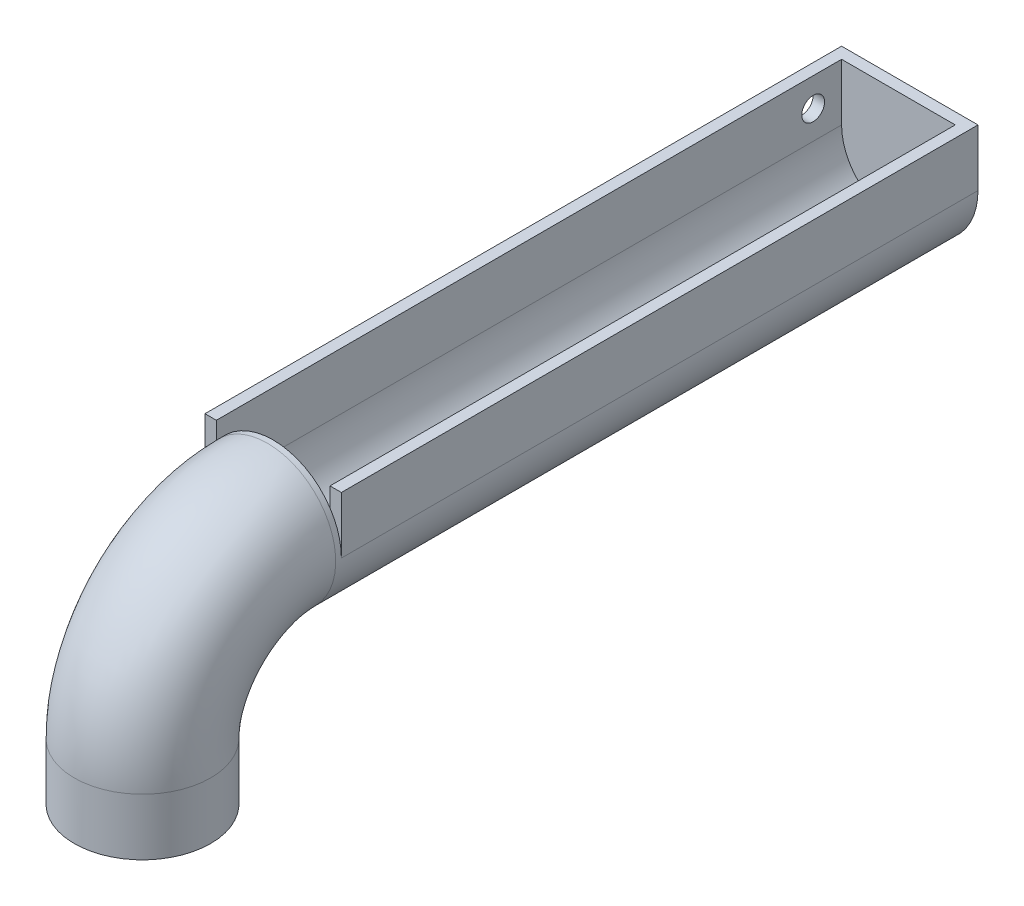
ISO-10303-21;
HEADER;
FILE_DESCRIPTION(('STEP AP214'),'2;1');
FILE_NAME('part.step','',(''),(''),'','','');
FILE_SCHEMA(('AUTOMOTIVE_DESIGN { 1 0 10303 214 1 1 1 1 }'));
ENDSEC;
DATA;
#1=APPLICATION_CONTEXT('core data for automotive mechanical design processes');
#2=APPLICATION_PROTOCOL_DEFINITION('international standard','automotive_design',2000,#1);
#3=PRODUCT_CONTEXT('',#1,'mechanical');
#4=PRODUCT('Part','Part','',(#3));
#5=PRODUCT_RELATED_PRODUCT_CATEGORY('part','',(#4));
#6=PRODUCT_DEFINITION_FORMATION('','',#4);
#7=PRODUCT_DEFINITION_CONTEXT('part definition',#1,'design');
#8=PRODUCT_DEFINITION('design','',#6,#7);
#9=PRODUCT_DEFINITION_SHAPE('','',#8);
#10=(LENGTH_UNIT() NAMED_UNIT(*) SI_UNIT(.MILLI.,.METRE.));
#11=(NAMED_UNIT(*) PLANE_ANGLE_UNIT() SI_UNIT($,.RADIAN.));
#12=(NAMED_UNIT(*) SI_UNIT($,.STERADIAN.) SOLID_ANGLE_UNIT());
#13=UNCERTAINTY_MEASURE_WITH_UNIT(LENGTH_MEASURE(1.E-05),#10,'distance_accuracy_value','');
#14=(GEOMETRIC_REPRESENTATION_CONTEXT(3) GLOBAL_UNCERTAINTY_ASSIGNED_CONTEXT((#13)) GLOBAL_UNIT_ASSIGNED_CONTEXT((#10,
#11,#12)) REPRESENTATION_CONTEXT('',''));
#15=CARTESIAN_POINT('',(0.,0.,0.));
#16=DIRECTION('',(0.,0.,1.));
#17=DIRECTION('',(1.,0.,0.));
#18=AXIS2_PLACEMENT_3D('',#15,#16,#17);
#19=CARTESIAN_POINT('',(0.,0.,110.));
#20=DIRECTION('',(0.,0.,1.));
#21=DIRECTION('',(1.,0.,0.));
#22=AXIS2_PLACEMENT_3D('',#19,#20,#21);
#23=PLANE('',#22);
#24=CARTESIAN_POINT('',(0.,0.,110.));
#25=DIRECTION('',(0.,0.,1.));
#26=DIRECTION('',(1.,0.,0.));
#27=AXIS2_PLACEMENT_3D('',#24,#25,#26);
#28=CIRCLE('',#27,12.);
#29=CARTESIAN_POINT('',(12.,0.,110.));
#30=VERTEX_POINT('',#29);
#31=CARTESIAN_POINT('',(10.,6.6332495807108,110.));
#32=VERTEX_POINT('',#31);
#33=EDGE_CURVE('E52',#30,#32,#28,.T.);
#34=ORIENTED_EDGE('',*,*,#33,.F.);
#35=DIRECTION('',(0.,1.,0.));
#36=VECTOR('',#35,1.);
#37=CARTESIAN_POINT('',(12.,10.,110.));
#38=LINE('',#37,#36);
#39=CARTESIAN_POINT('',(12.,10.,110.));
#40=VERTEX_POINT('',#39);
#41=EDGE_CURVE('E113',#30,#40,#38,.T.);
#42=ORIENTED_EDGE('',*,*,#41,.T.);
#43=DIRECTION('',(-1.,0.,0.));
#44=VECTOR('',#43,1.);
#45=CARTESIAN_POINT('',(10.,10.,110.));
#46=LINE('',#45,#44);
#47=CARTESIAN_POINT('',(10.,10.,110.));
#48=VERTEX_POINT('',#47);
#49=EDGE_CURVE('E183',#40,#48,#46,.T.);
#50=ORIENTED_EDGE('',*,*,#49,.T.);
#51=DIRECTION('',(0.,-1.,0.));
#52=VECTOR('',#51,1.);
#53=CARTESIAN_POINT('',(10.,10.,110.));
#54=LINE('',#53,#52);
#55=EDGE_CURVE('E138',#48,#32,#54,.T.);
#56=ORIENTED_EDGE('',*,*,#55,.T.);
#57=EDGE_LOOP('',(#34,#42,#50,#56));
#58=FACE_BOUND('',#57,.T.);
#59=ADVANCED_FACE('F41',(#58),#23,.T.);
#60=CARTESIAN_POINT('',(10.,10.,110.));
#61=DIRECTION('',(1.,0.,0.));
#62=DIRECTION('',(0.,0.,-1.));
#63=AXIS2_PLACEMENT_3D('',#60,#61,#62);
#64=PLANE('',#63);
#65=DIRECTION('',(0.,-1.,0.));
#66=VECTOR('',#65,1.);
#67=CARTESIAN_POINT('',(10.,10.,0.));
#68=LINE('',#67,#66);
#69=CARTESIAN_POINT('',(10.,10.,0.));
#70=VERTEX_POINT('',#69);
#71=CARTESIAN_POINT('',(10.,0.,0.));
#72=VERTEX_POINT('',#71);
#73=EDGE_CURVE('E180',#70,#72,#68,.T.);
#74=ORIENTED_EDGE('',*,*,#73,.T.);
#75=DIRECTION('',(0.,0.,-1.));
#76=VECTOR('',#75,1.);
#77=CARTESIAN_POINT('',(10.,0.,110.));
#78=LINE('',#77,#76);
#79=CARTESIAN_POINT('',(10.,0.,110.));
#80=VERTEX_POINT('',#79);
#81=EDGE_CURVE('E223',#80,#72,#78,.T.);
#82=ORIENTED_EDGE('',*,*,#81,.F.);
#83=EDGE_CURVE('E66',#32,#80,#54,.T.);
#84=ORIENTED_EDGE('',*,*,#83,.F.);
#85=ORIENTED_EDGE('',*,*,#55,.F.);
#86=DIRECTION('',(0.,0.,-1.));
#87=VECTOR('',#86,1.);
#88=CARTESIAN_POINT('',(10.,10.,110.));
#89=LINE('',#88,#87);
#90=EDGE_CURVE('E45',#48,#70,#89,.T.);
#91=ORIENTED_EDGE('',*,*,#90,.T.);
#92=EDGE_LOOP('',(#74,#82,#84,#85,#91));
#93=FACE_BOUND('',#92,.T.);
#94=ADVANCED_FACE('F43',(#93),#64,.F.);
#95=CARTESIAN_POINT('',(0.,0.,110.));
#96=DIRECTION('',(0.,0.,-1.));
#97=DIRECTION('',(-1.,0.,0.));
#98=AXIS2_PLACEMENT_3D('',#95,#96,#97);
#99=CYLINDRICAL_SURFACE('',#98,10.);
#100=CARTESIAN_POINT('',(0.,0.,0.));
#101=DIRECTION('',(0.,0.,-1.));
#102=DIRECTION('',(1.,0.,0.));
#103=AXIS2_PLACEMENT_3D('',#100,#101,#102);
#104=CIRCLE('',#103,10.);
#105=CARTESIAN_POINT('',(-10.,0.,0.));
#106=VERTEX_POINT('',#105);
#107=EDGE_CURVE('E202',#72,#106,#104,.T.);
#108=ORIENTED_EDGE('',*,*,#107,.T.);
#109=DIRECTION('',(0.,0.,-1.));
#110=VECTOR('',#109,1.);
#111=CARTESIAN_POINT('',(-10.,0.,110.));
#112=LINE('',#111,#110);
#113=CARTESIAN_POINT('',(-10.,0.,110.));
#114=VERTEX_POINT('',#113);
#115=EDGE_CURVE('E220',#114,#106,#112,.T.);
#116=ORIENTED_EDGE('',*,*,#115,.F.);
#117=CARTESIAN_POINT('',(0.,0.,110.));
#118=DIRECTION('',(0.,0.,1.));
#119=DIRECTION('',(1.,0.,0.));
#120=AXIS2_PLACEMENT_3D('',#117,#118,#119);
#121=CIRCLE('',#120,10.);
#122=EDGE_CURVE('E145',#114,#80,#121,.F.);
#123=ORIENTED_EDGE('',*,*,#122,.T.);
#124=ORIENTED_EDGE('',*,*,#81,.T.);
#125=EDGE_LOOP('',(#108,#116,#123,#124));
#126=FACE_BOUND('',#125,.T.);
#127=CARTESIAN_POINT('',(0.,0.,111.));
#128=DIRECTION('',(0.,0.,1.));
#129=DIRECTION('',(1.,0.,0.));
#130=AXIS2_PLACEMENT_3D('',#127,#128,#129);
#131=CIRCLE('',#130,10.);
#132=CARTESIAN_POINT('',(0.,9.99999999999999,111.));
#133=VERTEX_POINT('',#132);
#134=EDGE_CURVE('E246',#133,#133,#131,.F.);
#135=ORIENTED_EDGE('',*,*,#134,.F.);
#136=EDGE_LOOP('',(#135));
#137=FACE_BOUND('',#136,.T.);
#138=ADVANCED_FACE('F242',(#126,#137),#99,.F.);
#139=CARTESIAN_POINT('',(-10.,0.,110.));
#140=DIRECTION('',(-1.,0.,0.));
#141=DIRECTION('',(0.,0.,1.));
#142=AXIS2_PLACEMENT_3D('',#139,#140,#141);
#143=PLANE('',#142);
#144=CARTESIAN_POINT('',(-10.,5.,5.));
#145=DIRECTION('',(-1.,0.,0.));
#146=DIRECTION('',(0.,0.,1.));
#147=AXIS2_PLACEMENT_3D('',#144,#145,#146);
#148=CIRCLE('',#147,2.005);
#149=CARTESIAN_POINT('',(-10.,5.,7.005));
#150=VERTEX_POINT('',#149);
#151=EDGE_CURVE('E157',#150,#150,#148,.T.);
#152=ORIENTED_EDGE('',*,*,#151,.T.);
#153=EDGE_LOOP('',(#152));
#154=FACE_BOUND('',#153,.T.);
#155=DIRECTION('',(0.,1.,0.));
#156=VECTOR('',#155,1.);
#157=CARTESIAN_POINT('',(-10.,0.,0.));
#158=LINE('',#157,#156);
#159=CARTESIAN_POINT('',(-10.,10.,0.));
#160=VERTEX_POINT('',#159);
#161=EDGE_CURVE('E186',#106,#160,#158,.T.);
#162=ORIENTED_EDGE('',*,*,#161,.T.);
#163=DIRECTION('',(0.,0.,-1.));
#164=VECTOR('',#163,1.);
#165=CARTESIAN_POINT('',(-10.,10.,110.));
#166=LINE('',#165,#164);
#167=CARTESIAN_POINT('',(-10.,10.,110.));
#168=VERTEX_POINT('',#167);
#169=EDGE_CURVE('E216',#168,#160,#166,.T.);
#170=ORIENTED_EDGE('',*,*,#169,.F.);
#171=DIRECTION('',(0.,1.,0.));
#172=VECTOR('',#171,1.);
#173=CARTESIAN_POINT('',(-10.,0.,110.));
#174=LINE('',#173,#172);
#175=CARTESIAN_POINT('',(-10.,6.6332495807108,110.));
#176=VERTEX_POINT('',#175);
#177=EDGE_CURVE('E189',#176,#168,#174,.T.);
#178=ORIENTED_EDGE('',*,*,#177,.F.);
#179=EDGE_CURVE('E190',#114,#176,#174,.T.);
#180=ORIENTED_EDGE('',*,*,#179,.F.);
#181=ORIENTED_EDGE('',*,*,#115,.T.);
#182=EDGE_LOOP('',(#162,#170,#178,#180,#181));
#183=FACE_BOUND('',#182,.T.);
#184=ADVANCED_FACE('F239',(#154,#183),#143,.F.);
#185=CARTESIAN_POINT('',(-12.,10.,110.));
#186=DIRECTION('',(0.,-1.,0.));
#187=DIRECTION('',(0.,0.,-1.));
#188=AXIS2_PLACEMENT_3D('',#185,#186,#187);
#189=PLANE('',#188);
#190=ORIENTED_EDGE('',*,*,#169,.T.);
#191=DIRECTION('',(-1.,0.,0.));
#192=VECTOR('',#191,1.);
#193=CARTESIAN_POINT('',(0.,10.,0.));
#194=LINE('',#193,#192);
#195=EDGE_CURVE('E161',#70,#160,#194,.T.);
#196=ORIENTED_EDGE('',*,*,#195,.F.);
#197=ORIENTED_EDGE('',*,*,#90,.F.);
#198=ORIENTED_EDGE('',*,*,#49,.F.);
#199=DIRECTION('',(0.,0.,-1.));
#200=VECTOR('',#199,1.);
#201=CARTESIAN_POINT('',(12.,10.,110.));
#202=LINE('',#201,#200);
#203=CARTESIAN_POINT('',(12.,10.,-2.));
#204=VERTEX_POINT('',#203);
#205=EDGE_CURVE('E119',#40,#204,#202,.T.);
#206=ORIENTED_EDGE('',*,*,#205,.T.);
#207=DIRECTION('',(-1.,0.,0.));
#208=VECTOR('',#207,1.);
#209=CARTESIAN_POINT('',(0.,10.,-2.));
#210=LINE('',#209,#208);
#211=CARTESIAN_POINT('',(-12.,10.,-2.));
#212=VERTEX_POINT('',#211);
#213=EDGE_CURVE('E167',#204,#212,#210,.T.);
#214=ORIENTED_EDGE('',*,*,#213,.T.);
#215=DIRECTION('',(0.,0.,-1.));
#216=VECTOR('',#215,1.);
#217=CARTESIAN_POINT('',(-12.,10.,110.));
#218=LINE('',#217,#216);
#219=CARTESIAN_POINT('',(-12.,10.,110.));
#220=VERTEX_POINT('',#219);
#221=EDGE_CURVE('E213',#220,#212,#218,.T.);
#222=ORIENTED_EDGE('',*,*,#221,.F.);
#223=DIRECTION('',(-1.,0.,0.));
#224=VECTOR('',#223,1.);
#225=CARTESIAN_POINT('',(-12.,10.,110.));
#226=LINE('',#225,#224);
#227=EDGE_CURVE('E194',#168,#220,#226,.T.);
#228=ORIENTED_EDGE('',*,*,#227,.F.);
#229=EDGE_LOOP('',(#190,#196,#197,#198,#206,#214,#222,#228));
#230=FACE_BOUND('',#229,.T.);
#231=ADVANCED_FACE('F233',(#230),#189,.F.);
#232=CARTESIAN_POINT('',(-12.,0.,110.));
#233=DIRECTION('',(1.,0.,0.));
#234=DIRECTION('',(0.,0.,-1.));
#235=AXIS2_PLACEMENT_3D('',#232,#233,#234);
#236=PLANE('',#235);
#237=CARTESIAN_POINT('',(-12.,5.,5.));
#238=DIRECTION('',(-1.,0.,0.));
#239=DIRECTION('',(0.,0.,1.));
#240=AXIS2_PLACEMENT_3D('',#237,#238,#239);
#241=CIRCLE('',#240,2.005);
#242=CARTESIAN_POINT('',(-12.,5.,7.005));
#243=VERTEX_POINT('',#242);
#244=EDGE_CURVE('E162',#243,#243,#241,.T.);
#245=ORIENTED_EDGE('',*,*,#244,.F.);
#246=EDGE_LOOP('',(#245));
#247=FACE_BOUND('',#246,.T.);
#248=ORIENTED_EDGE('',*,*,#221,.T.);
#249=DIRECTION('',(0.,-1.,0.));
#250=VECTOR('',#249,1.);
#251=CARTESIAN_POINT('',(-12.,0.,-2.));
#252=LINE('',#251,#250);
#253=CARTESIAN_POINT('',(-12.,0.,-2.));
#254=VERTEX_POINT('',#253);
#255=EDGE_CURVE('E171',#212,#254,#252,.T.);
#256=ORIENTED_EDGE('',*,*,#255,.T.);
#257=DIRECTION('',(0.,0.,-1.));
#258=VECTOR('',#257,1.);
#259=CARTESIAN_POINT('',(-12.,0.,110.));
#260=LINE('',#259,#258);
#261=CARTESIAN_POINT('',(-12.,0.,110.));
#262=VERTEX_POINT('',#261);
#263=EDGE_CURVE('E136',#262,#254,#260,.T.);
#264=ORIENTED_EDGE('',*,*,#263,.F.);
#265=DIRECTION('',(0.,-1.,0.));
#266=VECTOR('',#265,1.);
#267=CARTESIAN_POINT('',(-12.,0.,110.));
#268=LINE('',#267,#266);
#269=EDGE_CURVE('E125',#220,#262,#268,.T.);
#270=ORIENTED_EDGE('',*,*,#269,.F.);
#271=EDGE_LOOP('',(#248,#256,#264,#270));
#272=FACE_BOUND('',#271,.T.);
#273=ADVANCED_FACE('F297',(#247,#272),#236,.F.);
#274=CARTESIAN_POINT('',(0.,0.,110.));
#275=DIRECTION('',(0.,0.,-1.));
#276=DIRECTION('',(-1.,0.,0.));
#277=AXIS2_PLACEMENT_3D('',#274,#275,#276);
#278=CYLINDRICAL_SURFACE('',#277,12.);
#279=ORIENTED_EDGE('',*,*,#263,.T.);
#280=CARTESIAN_POINT('',(0.,0.,-2.));
#281=DIRECTION('',(0.,0.,1.));
#282=DIRECTION('',(1.,0.,0.));
#283=AXIS2_PLACEMENT_3D('',#280,#281,#282);
#284=CIRCLE('',#283,12.);
#285=CARTESIAN_POINT('',(12.,0.,-2.));
#286=VERTEX_POINT('',#285);
#287=EDGE_CURVE('E133',#254,#286,#284,.T.);
#288=ORIENTED_EDGE('',*,*,#287,.T.);
#289=DIRECTION('',(0.,0.,-1.));
#290=VECTOR('',#289,1.);
#291=CARTESIAN_POINT('',(12.,0.,110.));
#292=LINE('',#291,#290);
#293=EDGE_CURVE('E117',#30,#286,#292,.T.);
#294=ORIENTED_EDGE('',*,*,#293,.F.);
#295=ORIENTED_EDGE('',*,*,#33,.T.);
#296=EDGE_CURVE('E53',#32,#176,#28,.T.);
#297=ORIENTED_EDGE('',*,*,#296,.T.);
#298=EDGE_CURVE('E11',#176,#262,#28,.T.);
#299=ORIENTED_EDGE('',*,*,#298,.T.);
#300=EDGE_LOOP('',(#279,#288,#294,#295,#297,#299));
#301=FACE_BOUND('',#300,.T.);
#302=CARTESIAN_POINT('',(0.,0.,111.));
#303=DIRECTION('',(0.,0.,1.));
#304=DIRECTION('',(1.,0.,0.));
#305=AXIS2_PLACEMENT_3D('',#302,#303,#304);
#306=CIRCLE('',#305,12.);
#307=CARTESIAN_POINT('',(0.,12.,111.));
#308=VERTEX_POINT('',#307);
#309=EDGE_CURVE('E150',#308,#308,#306,.T.);
#310=ORIENTED_EDGE('',*,*,#309,.F.);
#311=EDGE_LOOP('',(#310));
#312=FACE_BOUND('',#311,.T.);
#313=ADVANCED_FACE('F129',(#301,#312),#278,.T.);
#314=CARTESIAN_POINT('',(12.,10.,110.));
#315=DIRECTION('',(-1.,0.,0.));
#316=DIRECTION('',(0.,0.,1.));
#317=AXIS2_PLACEMENT_3D('',#314,#315,#316);
#318=PLANE('',#317);
#319=ORIENTED_EDGE('',*,*,#293,.T.);
#320=DIRECTION('',(0.,1.,0.));
#321=VECTOR('',#320,1.);
#322=CARTESIAN_POINT('',(12.,0.,-2.));
#323=LINE('',#322,#321);
#324=EDGE_CURVE('E177',#286,#204,#323,.T.);
#325=ORIENTED_EDGE('',*,*,#324,.T.);
#326=ORIENTED_EDGE('',*,*,#205,.F.);
#327=ORIENTED_EDGE('',*,*,#41,.F.);
#328=EDGE_LOOP('',(#319,#325,#326,#327));
#329=FACE_BOUND('',#328,.T.);
#330=ADVANCED_FACE('F115',(#329),#318,.F.);
#331=ORIENTED_EDGE('',*,*,#298,.F.);
#332=ORIENTED_EDGE('',*,*,#177,.T.);
#333=ORIENTED_EDGE('',*,*,#227,.T.);
#334=ORIENTED_EDGE('',*,*,#269,.T.);
#335=EDGE_LOOP('',(#331,#332,#333,#334));
#336=FACE_BOUND('',#335,.T.);
#337=ADVANCED_FACE('F283',(#336),#23,.T.);
#338=CARTESIAN_POINT('',(0.,0.,0.));
#339=DIRECTION('',(0.,0.,1.));
#340=DIRECTION('',(1.,0.,0.));
#341=AXIS2_PLACEMENT_3D('',#338,#339,#340);
#342=PLANE('',#341);
#343=ORIENTED_EDGE('',*,*,#161,.F.);
#344=ORIENTED_EDGE('',*,*,#107,.F.);
#345=ORIENTED_EDGE('',*,*,#73,.F.);
#346=ORIENTED_EDGE('',*,*,#195,.T.);
#347=EDGE_LOOP('',(#343,#344,#345,#346));
#348=FACE_BOUND('',#347,.T.);
#349=ADVANCED_FACE('F237',(#348),#342,.T.);
#350=CARTESIAN_POINT('',(0.,0.,-2.));
#351=DIRECTION('',(0.,0.,1.));
#352=DIRECTION('',(1.,0.,0.));
#353=AXIS2_PLACEMENT_3D('',#350,#351,#352);
#354=PLANE('',#353);
#355=ORIENTED_EDGE('',*,*,#213,.F.);
#356=ORIENTED_EDGE('',*,*,#324,.F.);
#357=ORIENTED_EDGE('',*,*,#287,.F.);
#358=ORIENTED_EDGE('',*,*,#255,.F.);
#359=EDGE_LOOP('',(#355,#356,#357,#358));
#360=FACE_BOUND('',#359,.T.);
#361=ADVANCED_FACE('F293',(#360),#354,.F.);
#362=CARTESIAN_POINT('',(-10.,5.,5.));
#363=DIRECTION('',(-1.,0.,0.));
#364=DIRECTION('',(0.,0.,1.));
#365=AXIS2_PLACEMENT_3D('',#362,#363,#364);
#366=CYLINDRICAL_SURFACE('',#365,2.005);
#367=ORIENTED_EDGE('',*,*,#151,.F.);
#368=EDGE_LOOP('',(#367));
#369=FACE_BOUND('',#368,.T.);
#370=ORIENTED_EDGE('',*,*,#244,.T.);
#371=EDGE_LOOP('',(#370));
#372=FACE_BOUND('',#371,.T.);
#373=ADVANCED_FACE('F334',(#369,#372),#366,.F.);
#374=CARTESIAN_POINT('',(0.,0.,110.));
#375=DIRECTION('',(0.,0.,1.));
#376=DIRECTION('',(1.,0.,0.));
#377=AXIS2_PLACEMENT_3D('',#374,#375,#376);
#378=PLANE('',#377);
#379=ORIENTED_EDGE('',*,*,#296,.F.);
#380=ORIENTED_EDGE('',*,*,#83,.T.);
#381=ORIENTED_EDGE('',*,*,#122,.F.);
#382=ORIENTED_EDGE('',*,*,#179,.T.);
#383=EDGE_LOOP('',(#379,#380,#381,#382));
#384=FACE_BOUND('',#383,.T.);
#385=ADVANCED_FACE('F267',(#384),#378,.F.);
#386=CARTESIAN_POINT('',(0.,-22.,111.));
#387=DIRECTION('',(1.,0.,0.));
#388=DIRECTION('',(0.,0.,-1.));
#389=AXIS2_PLACEMENT_3D('',#386,#387,#388);
#390=TOROIDAL_SURFACE('',#389,22.,12.);
#391=CARTESIAN_POINT('',(0.,-22.,133.));
#392=DIRECTION('',(0.,-1.,0.));
#393=DIRECTION('',(1.,0.,0.));
#394=AXIS2_PLACEMENT_3D('',#391,#392,#393);
#395=CIRCLE('',#394,12.);
#396=CARTESIAN_POINT('',(0.,-22.,145.));
#397=VERTEX_POINT('',#396);
#398=EDGE_CURVE('E147',#397,#397,#395,.T.);
#399=CARTESIAN_POINT('',(0.,-22.,111.));
#400=DIRECTION('',(1.,0.,0.));
#401=DIRECTION('',(0.,0.,-1.));
#402=AXIS2_PLACEMENT_3D('',#399,#400,#401);
#403=CIRCLE('',#402,34.);
#404=EDGE_CURVE('',#308,#397,#403,.T.);
#405=ORIENTED_EDGE('',*,*,#309,.T.);
#406=ORIENTED_EDGE('',*,*,#398,.F.);
#407=ORIENTED_EDGE('',*,*,#404,.T.);
#408=ORIENTED_EDGE('',*,*,#404,.F.);
#409=EDGE_LOOP('',(#405,#407,#406,#408));
#410=FACE_BOUND('',#409,.T.);
#411=ADVANCED_FACE('F333',(#410),#390,.T.);
#412=CARTESIAN_POINT('',(0.,-22.,133.));
#413=DIRECTION('',(0.,-1.,0.));
#414=DIRECTION('',(0.,0.,-1.));
#415=AXIS2_PLACEMENT_3D('',#412,#413,#414);
#416=CYLINDRICAL_SURFACE('',#415,12.);
#417=CARTESIAN_POINT('',(0.,-32.,133.));
#418=DIRECTION('',(0.,-1.,0.));
#419=DIRECTION('',(1.,0.,0.));
#420=AXIS2_PLACEMENT_3D('',#417,#418,#419);
#421=CIRCLE('',#420,12.);
#422=CARTESIAN_POINT('',(12.,-32.,133.));
#423=VERTEX_POINT('',#422);
#424=EDGE_CURVE('E141',#423,#423,#421,.T.);
#425=ORIENTED_EDGE('',*,*,#424,.F.);
#426=EDGE_LOOP('',(#425));
#427=FACE_BOUND('',#426,.T.);
#428=ORIENTED_EDGE('',*,*,#398,.T.);
#429=EDGE_LOOP('',(#428));
#430=FACE_BOUND('',#429,.T.);
#431=ADVANCED_FACE('F344',(#427,#430),#416,.T.);
#432=CARTESIAN_POINT('',(0.,-32.,133.));
#433=DIRECTION('',(0.,-1.,0.));
#434=DIRECTION('',(1.,0.,0.));
#435=AXIS2_PLACEMENT_3D('',#432,#433,#434);
#436=PLANE('',#435);
#437=CARTESIAN_POINT('',(0.,-32.,133.));
#438=DIRECTION('',(0.,-1.,0.));
#439=DIRECTION('',(1.,0.,0.));
#440=AXIS2_PLACEMENT_3D('',#437,#438,#439);
#441=CIRCLE('',#440,10.);
#442=CARTESIAN_POINT('',(10.,-32.,133.));
#443=VERTEX_POINT('',#442);
#444=EDGE_CURVE('E166',#443,#443,#441,.F.);
#445=ORIENTED_EDGE('',*,*,#444,.T.);
#446=EDGE_LOOP('',(#445));
#447=FACE_BOUND('',#446,.T.);
#448=ORIENTED_EDGE('',*,*,#424,.T.);
#449=EDGE_LOOP('',(#448));
#450=FACE_BOUND('',#449,.T.);
#451=ADVANCED_FACE('F259',(#447,#450),#436,.T.);
#452=CARTESIAN_POINT('',(0.,-22.,111.));
#453=DIRECTION('',(1.,0.,0.));
#454=DIRECTION('',(0.,0.,-1.));
#455=AXIS2_PLACEMENT_3D('',#452,#453,#454);
#456=TOROIDAL_SURFACE('',#455,22.,10.);
#457=CARTESIAN_POINT('',(0.,-22.,133.));
#458=DIRECTION('',(0.,-1.,0.));
#459=DIRECTION('',(1.,0.,0.));
#460=AXIS2_PLACEMENT_3D('',#457,#458,#459);
#461=CIRCLE('',#460,10.);
#462=CARTESIAN_POINT('',(0.,-22.,143.));
#463=VERTEX_POINT('',#462);
#464=EDGE_CURVE('E250',#463,#463,#461,.F.);
#465=CARTESIAN_POINT('',(0.,-22.,111.));
#466=DIRECTION('',(1.,0.,0.));
#467=DIRECTION('',(0.,0.,-1.));
#468=AXIS2_PLACEMENT_3D('',#465,#466,#467);
#469=CIRCLE('',#468,32.);
#470=EDGE_CURVE('',#133,#463,#469,.T.);
#471=ORIENTED_EDGE('',*,*,#134,.T.);
#472=ORIENTED_EDGE('',*,*,#464,.F.);
#473=ORIENTED_EDGE('',*,*,#470,.T.);
#474=ORIENTED_EDGE('',*,*,#470,.F.);
#475=EDGE_LOOP('',(#471,#473,#472,#474));
#476=FACE_BOUND('',#475,.T.);
#477=ADVANCED_FACE('F265',(#476),#456,.F.);
#478=CARTESIAN_POINT('',(0.,-22.,133.));
#479=DIRECTION('',(0.,-1.,0.));
#480=DIRECTION('',(0.,0.,-1.));
#481=AXIS2_PLACEMENT_3D('',#478,#479,#480);
#482=CYLINDRICAL_SURFACE('',#481,10.);
#483=ORIENTED_EDGE('',*,*,#444,.F.);
#484=EDGE_LOOP('',(#483));
#485=FACE_BOUND('',#484,.T.);
#486=ORIENTED_EDGE('',*,*,#464,.T.);
#487=EDGE_LOOP('',(#486));
#488=FACE_BOUND('',#487,.T.);
#489=ADVANCED_FACE('F262',(#485,#488),#482,.F.);
#490=CLOSED_SHELL('',(#59,#94,#138,#184,#231,#273,#313,#330,#337,#349,#361,#373,#385,#411,#431,
#451,#477,#489));
#491=MANIFOLD_SOLID_BREP('B2',#490);
#492=ADVANCED_BREP_SHAPE_REPRESENTATION('',(#18,#491),#14);
#493=SHAPE_DEFINITION_REPRESENTATION(#9,#492);
ENDSEC;
END-ISO-10303-21;
